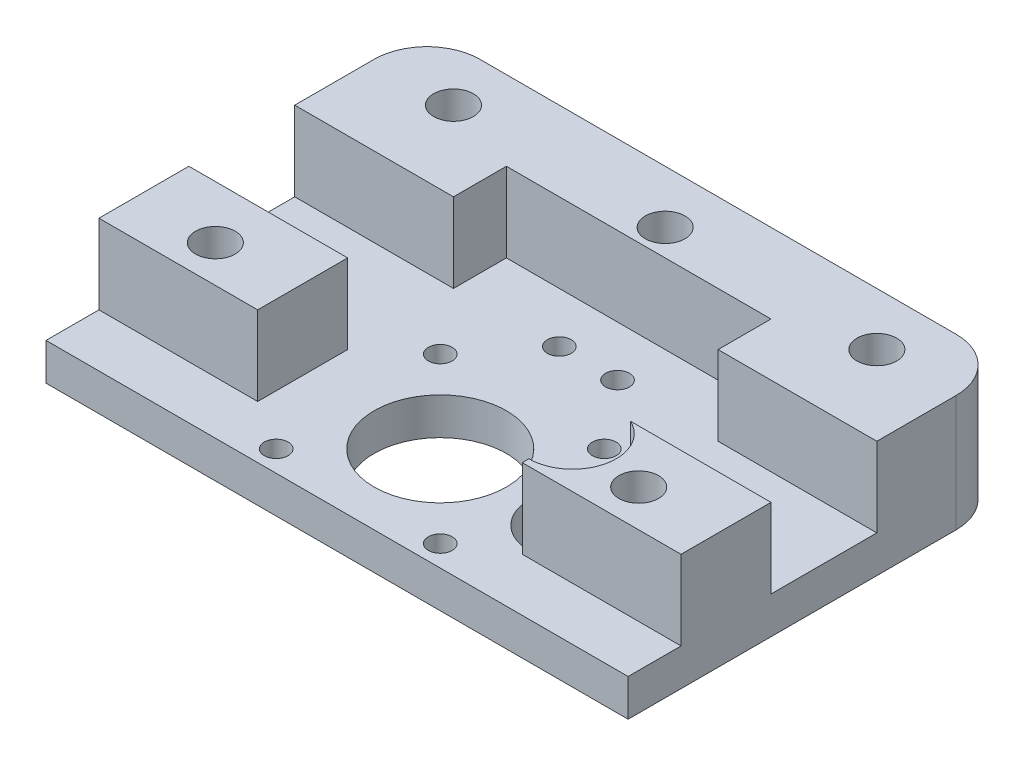
ISO-10303-21;
HEADER;
FILE_DESCRIPTION(('STEP AP214'),'2;1');
FILE_NAME('part.step','',(''),(''),'','','');
FILE_SCHEMA(('AUTOMOTIVE_DESIGN { 1 0 10303 214 1 1 1 1 }'));
ENDSEC;
DATA;
#1=APPLICATION_CONTEXT('core data for automotive mechanical design processes');
#2=APPLICATION_PROTOCOL_DEFINITION('international standard','automotive_design',2000,#1);
#3=PRODUCT_CONTEXT('',#1,'mechanical');
#4=PRODUCT('Part','Part','',(#3));
#5=PRODUCT_RELATED_PRODUCT_CATEGORY('part','',(#4));
#6=PRODUCT_DEFINITION_FORMATION('','',#4);
#7=PRODUCT_DEFINITION_CONTEXT('part definition',#1,'design');
#8=PRODUCT_DEFINITION('design','',#6,#7);
#9=PRODUCT_DEFINITION_SHAPE('','',#8);
#10=(LENGTH_UNIT() NAMED_UNIT(*) SI_UNIT(.MILLI.,.METRE.));
#11=(NAMED_UNIT(*) PLANE_ANGLE_UNIT() SI_UNIT($,.RADIAN.));
#12=(NAMED_UNIT(*) SI_UNIT($,.STERADIAN.) SOLID_ANGLE_UNIT());
#13=UNCERTAINTY_MEASURE_WITH_UNIT(LENGTH_MEASURE(1.E-05),#10,'distance_accuracy_value','');
#14=(GEOMETRIC_REPRESENTATION_CONTEXT(3) GLOBAL_UNCERTAINTY_ASSIGNED_CONTEXT((#13)) GLOBAL_UNIT_ASSIGNED_CONTEXT((#10,
#11,#12)) REPRESENTATION_CONTEXT('',''));
#15=CARTESIAN_POINT('',(0.,0.,0.));
#16=DIRECTION('',(0.,0.,1.));
#17=DIRECTION('',(1.,0.,0.));
#18=AXIS2_PLACEMENT_3D('',#15,#16,#17);
#19=CARTESIAN_POINT('',(-25.,22.,-21.));
#20=DIRECTION('',(-1.,0.,0.));
#21=DIRECTION('',(0.,0.,1.));
#22=AXIS2_PLACEMENT_3D('',#19,#20,#21);
#23=PLANE('',#22);
#24=DIRECTION('',(0.,0.,-1.));
#25=VECTOR('',#24,1.);
#26=CARTESIAN_POINT('',(-25.,7.,-21.));
#27=LINE('',#26,#25);
#28=CARTESIAN_POINT('',(-25.,7.,26.));
#29=VERTEX_POINT('',#28);
#30=CARTESIAN_POINT('',(-25.,7.,9.00000000000001));
#31=VERTEX_POINT('',#30);
#32=EDGE_CURVE('E236',#29,#31,#27,.T.);
#33=ORIENTED_EDGE('',*,*,#32,.T.);
#34=DIRECTION('',(0.,1.,0.));
#35=VECTOR('',#34,1.);
#36=CARTESIAN_POINT('',(-25.,-29.0555127546399,9.00000000000001));
#37=LINE('',#36,#35);
#38=CARTESIAN_POINT('',(-25.,22.,9.00000000000001));
#39=VERTEX_POINT('',#38);
#40=EDGE_CURVE('E502',#31,#39,#37,.T.);
#41=ORIENTED_EDGE('',*,*,#40,.T.);
#42=DIRECTION('',(0.,0.,-1.));
#43=VECTOR('',#42,1.);
#44=CARTESIAN_POINT('',(-25.,22.,-21.));
#45=LINE('',#44,#43);
#46=CARTESIAN_POINT('',(-25.,22.,26.));
#47=VERTEX_POINT('',#46);
#48=EDGE_CURVE('E215',#47,#39,#45,.T.);
#49=ORIENTED_EDGE('',*,*,#48,.F.);
#50=DIRECTION('',(0.,-1.,0.));
#51=VECTOR('',#50,1.);
#52=CARTESIAN_POINT('',(-25.,22.,26.));
#53=LINE('',#52,#51);
#54=EDGE_CURVE('E267',#47,#29,#53,.T.);
#55=ORIENTED_EDGE('',*,*,#54,.T.);
#56=EDGE_LOOP('',(#33,#41,#49,#55));
#57=FACE_BOUND('',#56,.T.);
#58=ADVANCED_FACE('F39',(#57),#23,.F.);
#59=CARTESIAN_POINT('',(25.,22.,-21.));
#60=DIRECTION('',(1.,0.,0.));
#61=DIRECTION('',(0.,0.,-1.));
#62=AXIS2_PLACEMENT_3D('',#59,#60,#61);
#63=PLANE('',#62);
#64=DIRECTION('',(0.,0.,1.));
#65=VECTOR('',#64,1.);
#66=CARTESIAN_POINT('',(25.,22.,-21.));
#67=LINE('',#66,#65);
#68=CARTESIAN_POINT('',(25.,22.,24.75));
#69=VERTEX_POINT('',#68);
#70=CARTESIAN_POINT('',(25.,22.,26.));
#71=VERTEX_POINT('',#70);
#72=EDGE_CURVE('E197',#69,#71,#67,.T.);
#73=ORIENTED_EDGE('',*,*,#72,.F.);
#74=DIRECTION('',(0.,-1.,0.));
#75=VECTOR('',#74,1.);
#76=CARTESIAN_POINT('',(25.,22.,24.75));
#77=LINE('',#76,#75);
#78=CARTESIAN_POINT('',(25.,7.,24.75));
#79=VERTEX_POINT('',#78);
#80=EDGE_CURVE('E181',#69,#79,#77,.T.);
#81=ORIENTED_EDGE('',*,*,#80,.T.);
#82=DIRECTION('',(0.,0.,1.));
#83=VECTOR('',#82,1.);
#84=CARTESIAN_POINT('',(25.,7.,-21.));
#85=LINE('',#84,#83);
#86=CARTESIAN_POINT('',(25.,7.,26.));
#87=VERTEX_POINT('',#86);
#88=EDGE_CURVE('E249',#79,#87,#85,.T.);
#89=ORIENTED_EDGE('',*,*,#88,.T.);
#90=DIRECTION('',(0.,-1.,0.));
#91=VECTOR('',#90,1.);
#92=CARTESIAN_POINT('',(25.,22.,26.));
#93=LINE('',#92,#91);
#94=EDGE_CURVE('E205',#71,#87,#93,.T.);
#95=ORIENTED_EDGE('',*,*,#94,.F.);
#96=EDGE_LOOP('',(#73,#81,#89,#95));
#97=FACE_BOUND('',#96,.T.);
#98=ADVANCED_FACE('F203',(#97),#63,.F.);
#99=CARTESIAN_POINT('',(0.,22.,0.));
#100=DIRECTION('',(0.,1.,0.));
#101=DIRECTION('',(0.,0.,1.));
#102=AXIS2_PLACEMENT_3D('',#99,#100,#101);
#103=PLANE('',#102);
#104=CARTESIAN_POINT('',(25.,22.,16.5));
#105=DIRECTION('',(0.,-1.,0.));
#106=DIRECTION('',(0.,0.,-1.));
#107=AXIS2_PLACEMENT_3D('',#104,#105,#106);
#108=CIRCLE('',#107,8.25);
#109=CARTESIAN_POINT('',(28.4369317712169,22.,9.00000000000001));
#110=VERTEX_POINT('',#109);
#111=EDGE_CURVE('E55',#110,#69,#108,.T.);
#112=ORIENTED_EDGE('',*,*,#111,.T.);
#113=ORIENTED_EDGE('',*,*,#72,.T.);
#114=DIRECTION('',(1.,0.,0.));
#115=VECTOR('',#114,1.);
#116=CARTESIAN_POINT('',(55.,22.,26.));
#117=LINE('',#116,#115);
#118=CARTESIAN_POINT('',(55.,22.,26.));
#119=VERTEX_POINT('',#118);
#120=EDGE_CURVE('E214',#71,#119,#117,.T.);
#121=ORIENTED_EDGE('',*,*,#120,.T.);
#122=DIRECTION('',(0.,0.,-1.));
#123=VECTOR('',#122,1.);
#124=CARTESIAN_POINT('',(55.,22.,-36.));
#125=LINE('',#124,#123);
#126=CARTESIAN_POINT('',(55.,22.,9.));
#127=VERTEX_POINT('',#126);
#128=EDGE_CURVE('E222',#119,#127,#125,.T.);
#129=ORIENTED_EDGE('',*,*,#128,.T.);
#130=DIRECTION('',(1.,0.,0.));
#131=VECTOR('',#130,1.);
#132=CARTESIAN_POINT('',(55.,22.,9.));
#133=LINE('',#132,#131);
#134=EDGE_CURVE('E200',#110,#127,#133,.T.);
#135=ORIENTED_EDGE('',*,*,#134,.F.);
#136=EDGE_LOOP('',(#112,#113,#121,#129,#135));
#137=FACE_BOUND('',#136,.T.);
#138=CARTESIAN_POINT('',(40.,22.,19.));
#139=DIRECTION('',(0.,-1.,0.));
#140=DIRECTION('',(0.,0.,-1.));
#141=AXIS2_PLACEMENT_3D('',#138,#139,#140);
#142=CIRCLE('',#141,3.75);
#143=CARTESIAN_POINT('',(40.,22.,15.25));
#144=VERTEX_POINT('',#143);
#145=EDGE_CURVE('E547',#144,#144,#142,.T.);
#146=ORIENTED_EDGE('',*,*,#145,.T.);
#147=EDGE_LOOP('',(#146));
#148=FACE_BOUND('',#147,.T.);
#149=ADVANCED_FACE('F195',(#137,#148),#103,.T.);
#150=DIRECTION('',(1.,0.,0.));
#151=VECTOR('',#150,1.);
#152=CARTESIAN_POINT('',(-25.,22.,9.00000000000001));
#153=LINE('',#152,#151);
#154=CARTESIAN_POINT('',(-55.,22.,9.00000000000002));
#155=VERTEX_POINT('',#154);
#156=EDGE_CURVE('E507',#155,#39,#153,.T.);
#157=ORIENTED_EDGE('',*,*,#156,.F.);
#158=DIRECTION('',(0.,0.,1.));
#159=VECTOR('',#158,1.);
#160=CARTESIAN_POINT('',(-55.,22.,-36.));
#161=LINE('',#160,#159);
#162=CARTESIAN_POINT('',(-55.,22.,26.));
#163=VERTEX_POINT('',#162);
#164=EDGE_CURVE('E253',#155,#163,#161,.T.);
#165=ORIENTED_EDGE('',*,*,#164,.T.);
#166=DIRECTION('',(1.,0.,0.));
#167=VECTOR('',#166,1.);
#168=CARTESIAN_POINT('',(-55.,22.,26.));
#169=LINE('',#168,#167);
#170=EDGE_CURVE('E432',#163,#47,#169,.T.);
#171=ORIENTED_EDGE('',*,*,#170,.T.);
#172=ORIENTED_EDGE('',*,*,#48,.T.);
#173=EDGE_LOOP('',(#157,#165,#171,#172));
#174=FACE_BOUND('',#173,.T.);
#175=CARTESIAN_POINT('',(-40.,22.,19.));
#176=DIRECTION('',(0.,-1.,0.));
#177=DIRECTION('',(0.,0.,-1.));
#178=AXIS2_PLACEMENT_3D('',#175,#176,#177);
#179=CIRCLE('',#178,3.75);
#180=CARTESIAN_POINT('',(-40.,22.,15.25));
#181=VERTEX_POINT('',#180);
#182=EDGE_CURVE('E531',#181,#181,#179,.T.);
#183=ORIENTED_EDGE('',*,*,#182,.T.);
#184=EDGE_LOOP('',(#183));
#185=FACE_BOUND('',#184,.T.);
#186=ADVANCED_FACE('F572',(#174,#185),#103,.T.);
#187=CARTESIAN_POINT('',(0.,7.,0.));
#188=DIRECTION('',(0.,1.,0.));
#189=DIRECTION('',(0.,0.,1.));
#190=AXIS2_PLACEMENT_3D('',#187,#188,#189);
#191=PLANE('',#190);
#192=DIRECTION('',(1.,0.,0.));
#193=VECTOR('',#192,1.);
#194=CARTESIAN_POINT('',(55.,7.,26.));
#195=LINE('',#194,#193);
#196=CARTESIAN_POINT('',(55.,7.,26.));
#197=VERTEX_POINT('',#196);
#198=EDGE_CURVE('E248',#87,#197,#195,.T.);
#199=ORIENTED_EDGE('',*,*,#198,.F.);
#200=ORIENTED_EDGE('',*,*,#88,.F.);
#201=CARTESIAN_POINT('',(25.,7.,16.5));
#202=DIRECTION('',(0.,1.,0.));
#203=DIRECTION('',(0.,0.,1.));
#204=AXIS2_PLACEMENT_3D('',#201,#202,#203);
#205=CIRCLE('',#204,8.25);
#206=CARTESIAN_POINT('',(28.4369317712169,7.,9.00000000000001));
#207=VERTEX_POINT('',#206);
#208=EDGE_CURVE('E185',#207,#79,#205,.T.);
#209=ORIENTED_EDGE('',*,*,#208,.F.);
#210=DIRECTION('',(-1.,0.,0.));
#211=VECTOR('',#210,1.);
#212=CARTESIAN_POINT('',(55.,7.,9.));
#213=LINE('',#212,#211);
#214=CARTESIAN_POINT('',(55.,7.,9.));
#215=VERTEX_POINT('',#214);
#216=EDGE_CURVE('E483',#215,#207,#213,.T.);
#217=ORIENTED_EDGE('',*,*,#216,.F.);
#218=DIRECTION('',(0.,0.,1.));
#219=VECTOR('',#218,1.);
#220=CARTESIAN_POINT('',(55.,7.,9.));
#221=LINE('',#220,#219);
#222=CARTESIAN_POINT('',(55.,7.,-11.));
#223=VERTEX_POINT('',#222);
#224=EDGE_CURVE('E479',#223,#215,#221,.T.);
#225=ORIENTED_EDGE('',*,*,#224,.F.);
#226=DIRECTION('',(1.,0.,0.));
#227=VECTOR('',#226,1.);
#228=CARTESIAN_POINT('',(55.,7.,-11.));
#229=LINE('',#228,#227);
#230=CARTESIAN_POINT('',(25.,7.,-11.));
#231=VERTEX_POINT('',#230);
#232=EDGE_CURVE('E493',#231,#223,#229,.T.);
#233=ORIENTED_EDGE('',*,*,#232,.F.);
#234=CARTESIAN_POINT('',(25.,7.,-21.));
#235=VERTEX_POINT('',#234);
#236=EDGE_CURVE('E244',#235,#231,#85,.T.);
#237=ORIENTED_EDGE('',*,*,#236,.F.);
#238=DIRECTION('',(1.,0.,0.));
#239=VECTOR('',#238,1.);
#240=CARTESIAN_POINT('',(25.,7.,-21.));
#241=LINE('',#240,#239);
#242=CARTESIAN_POINT('',(-25.,7.,-21.));
#243=VERTEX_POINT('',#242);
#244=EDGE_CURVE('E240',#243,#235,#241,.T.);
#245=ORIENTED_EDGE('',*,*,#244,.F.);
#246=CARTESIAN_POINT('',(-25.,7.,-11.));
#247=VERTEX_POINT('',#246);
#248=EDGE_CURVE('E234',#247,#243,#27,.T.);
#249=ORIENTED_EDGE('',*,*,#248,.F.);
#250=DIRECTION('',(1.,0.,0.));
#251=VECTOR('',#250,1.);
#252=CARTESIAN_POINT('',(-25.,7.,-11.));
#253=LINE('',#252,#251);
#254=CARTESIAN_POINT('',(-55.,7.,-11.));
#255=VERTEX_POINT('',#254);
#256=EDGE_CURVE('E464',#255,#247,#253,.T.);
#257=ORIENTED_EDGE('',*,*,#256,.F.);
#258=DIRECTION('',(0.,0.,-1.));
#259=VECTOR('',#258,1.);
#260=CARTESIAN_POINT('',(-55.,7.,9.00000000000002));
#261=LINE('',#260,#259);
#262=CARTESIAN_POINT('',(-55.,7.,9.00000000000002));
#263=VERTEX_POINT('',#262);
#264=EDGE_CURVE('E497',#263,#255,#261,.T.);
#265=ORIENTED_EDGE('',*,*,#264,.F.);
#266=DIRECTION('',(-1.,0.,0.));
#267=VECTOR('',#266,1.);
#268=CARTESIAN_POINT('',(-25.,7.,9.00000000000001));
#269=LINE('',#268,#267);
#270=EDGE_CURVE('E501',#31,#263,#269,.T.);
#271=ORIENTED_EDGE('',*,*,#270,.F.);
#272=ORIENTED_EDGE('',*,*,#32,.F.);
#273=DIRECTION('',(1.,0.,0.));
#274=VECTOR('',#273,1.);
#275=CARTESIAN_POINT('',(-55.,7.,26.));
#276=LINE('',#275,#274);
#277=CARTESIAN_POINT('',(-55.,7.,26.));
#278=VERTEX_POINT('',#277);
#279=EDGE_CURVE('E230',#278,#29,#276,.T.);
#280=ORIENTED_EDGE('',*,*,#279,.F.);
#281=DIRECTION('',(0.,0.,1.));
#282=VECTOR('',#281,1.);
#283=CARTESIAN_POINT('',(-55.,7.,-36.));
#284=LINE('',#283,#282);
#285=CARTESIAN_POINT('',(-55.,7.,36.));
#286=VERTEX_POINT('',#285);
#287=EDGE_CURVE('E341',#278,#286,#284,.T.);
#288=ORIENTED_EDGE('',*,*,#287,.T.);
#289=DIRECTION('',(1.,0.,0.));
#290=VECTOR('',#289,1.);
#291=CARTESIAN_POINT('',(-55.,7.,36.));
#292=LINE('',#291,#290);
#293=CARTESIAN_POINT('',(55.,7.,36.));
#294=VERTEX_POINT('',#293);
#295=EDGE_CURVE('E345',#286,#294,#292,.T.);
#296=ORIENTED_EDGE('',*,*,#295,.T.);
#297=DIRECTION('',(0.,0.,-1.));
#298=VECTOR('',#297,1.);
#299=CARTESIAN_POINT('',(55.,7.,-36.));
#300=LINE('',#299,#298);
#301=EDGE_CURVE('E338',#294,#197,#300,.T.);
#302=ORIENTED_EDGE('',*,*,#301,.T.);
#303=EDGE_LOOP('',(#199,#200,#209,#217,#225,#233,#237,#245,#249,#257,#265,#271,#272,#280,#288,
#296,#302));
#304=FACE_BOUND('',#303,.T.);
#305=CARTESIAN_POINT('',(-5.5,7.,-11.5));
#306=DIRECTION('',(0.,1.,0.));
#307=DIRECTION('',(0.,0.,1.));
#308=AXIS2_PLACEMENT_3D('',#305,#306,#307);
#309=CIRCLE('',#308,2.25);
#310=CARTESIAN_POINT('',(-5.5,7.,-9.24999999999999));
#311=VERTEX_POINT('',#310);
#312=EDGE_CURVE('E284',#311,#311,#309,.T.);
#313=ORIENTED_EDGE('',*,*,#312,.F.);
#314=EDGE_LOOP('',(#313));
#315=FACE_BOUND('',#314,.T.);
#316=CARTESIAN_POINT('',(15.5,7.,32.));
#317=DIRECTION('',(0.,1.,0.));
#318=DIRECTION('',(0.,0.,1.));
#319=AXIS2_PLACEMENT_3D('',#316,#317,#318);
#320=CIRCLE('',#319,2.25);
#321=CARTESIAN_POINT('',(15.5,7.,34.25));
#322=VERTEX_POINT('',#321);
#323=EDGE_CURVE('E298',#322,#322,#320,.T.);
#324=ORIENTED_EDGE('',*,*,#323,.F.);
#325=EDGE_LOOP('',(#324));
#326=FACE_BOUND('',#325,.T.);
#327=CARTESIAN_POINT('',(-15.5,7.,32.));
#328=DIRECTION('',(0.,1.,0.));
#329=DIRECTION('',(0.,0.,1.));
#330=AXIS2_PLACEMENT_3D('',#327,#328,#329);
#331=CIRCLE('',#330,2.25);
#332=CARTESIAN_POINT('',(-15.5,7.,34.25));
#333=VERTEX_POINT('',#332);
#334=EDGE_CURVE('E314',#333,#333,#331,.T.);
#335=ORIENTED_EDGE('',*,*,#334,.F.);
#336=EDGE_LOOP('',(#335));
#337=FACE_BOUND('',#336,.T.);
#338=CARTESIAN_POINT('',(0.,7.,16.5));
#339=DIRECTION('',(0.,1.,0.));
#340=DIRECTION('',(0.,0.,1.));
#341=AXIS2_PLACEMENT_3D('',#338,#339,#340);
#342=CIRCLE('',#341,12.5);
#343=CARTESIAN_POINT('',(0.,7.,29.));
#344=VERTEX_POINT('',#343);
#345=EDGE_CURVE('E330',#344,#344,#342,.T.);
#346=ORIENTED_EDGE('',*,*,#345,.F.);
#347=EDGE_LOOP('',(#346));
#348=FACE_BOUND('',#347,.T.);
#349=CARTESIAN_POINT('',(-15.5,7.,1.));
#350=DIRECTION('',(0.,1.,0.));
#351=DIRECTION('',(0.,0.,1.));
#352=AXIS2_PLACEMENT_3D('',#349,#350,#351);
#353=CIRCLE('',#352,2.25);
#354=CARTESIAN_POINT('',(-15.5,7.,3.25));
#355=VERTEX_POINT('',#354);
#356=EDGE_CURVE('E322',#355,#355,#353,.T.);
#357=ORIENTED_EDGE('',*,*,#356,.F.);
#358=EDGE_LOOP('',(#357));
#359=FACE_BOUND('',#358,.T.);
#360=CARTESIAN_POINT('',(15.5,7.,1.));
#361=DIRECTION('',(0.,1.,0.));
#362=DIRECTION('',(0.,0.,1.));
#363=AXIS2_PLACEMENT_3D('',#360,#361,#362);
#364=CIRCLE('',#363,2.25);
#365=CARTESIAN_POINT('',(15.5,7.,3.25));
#366=VERTEX_POINT('',#365);
#367=EDGE_CURVE('E306',#366,#366,#364,.T.);
#368=ORIENTED_EDGE('',*,*,#367,.F.);
#369=EDGE_LOOP('',(#368));
#370=FACE_BOUND('',#369,.T.);
#371=CARTESIAN_POINT('',(5.5,7.,-11.5));
#372=DIRECTION('',(0.,1.,0.));
#373=DIRECTION('',(0.,0.,1.));
#374=AXIS2_PLACEMENT_3D('',#371,#372,#373);
#375=CIRCLE('',#374,2.25);
#376=CARTESIAN_POINT('',(5.5,7.,-9.24999999999999));
#377=VERTEX_POINT('',#376);
#378=EDGE_CURVE('E276',#377,#377,#375,.T.);
#379=ORIENTED_EDGE('',*,*,#378,.F.);
#380=EDGE_LOOP('',(#379));
#381=FACE_BOUND('',#380,.T.);
#382=ADVANCED_FACE('F564',(#304,#315,#326,#337,#348,#359,#370,#381),#191,.T.);
#383=CARTESIAN_POINT('',(0.,0.,0.));
#384=DIRECTION('',(0.,1.,0.));
#385=DIRECTION('',(0.,0.,1.));
#386=AXIS2_PLACEMENT_3D('',#383,#384,#385);
#387=PLANE('',#386);
#388=CARTESIAN_POINT('',(40.,0.,19.));
#389=DIRECTION('',(0.,-1.,0.));
#390=DIRECTION('',(0.,0.,-1.));
#391=AXIS2_PLACEMENT_3D('',#388,#389,#390);
#392=CIRCLE('',#391,3.75);
#393=CARTESIAN_POINT('',(40.,0.,15.25));
#394=VERTEX_POINT('',#393);
#395=EDGE_CURVE('E496',#394,#394,#392,.T.);
#396=ORIENTED_EDGE('',*,*,#395,.F.);
#397=EDGE_LOOP('',(#396));
#398=FACE_BOUND('',#397,.T.);
#399=CARTESIAN_POINT('',(0.,0.,-26.));
#400=DIRECTION('',(0.,-1.,0.));
#401=DIRECTION('',(0.,0.,-1.));
#402=AXIS2_PLACEMENT_3D('',#399,#400,#401);
#403=CIRCLE('',#402,3.75);
#404=CARTESIAN_POINT('',(0.,0.,-29.75));
#405=VERTEX_POINT('',#404);
#406=EDGE_CURVE('E543',#405,#405,#403,.T.);
#407=ORIENTED_EDGE('',*,*,#406,.F.);
#408=EDGE_LOOP('',(#407));
#409=FACE_BOUND('',#408,.T.);
#410=CARTESIAN_POINT('',(-40.,0.,19.));
#411=DIRECTION('',(0.,-1.,0.));
#412=DIRECTION('',(0.,0.,-1.));
#413=AXIS2_PLACEMENT_3D('',#410,#411,#412);
#414=CIRCLE('',#413,3.75);
#415=CARTESIAN_POINT('',(-40.,0.,15.25));
#416=VERTEX_POINT('',#415);
#417=EDGE_CURVE('E535',#416,#416,#414,.T.);
#418=ORIENTED_EDGE('',*,*,#417,.F.);
#419=EDGE_LOOP('',(#418));
#420=FACE_BOUND('',#419,.T.);
#421=CARTESIAN_POINT('',(-40.,0.,-26.));
#422=DIRECTION('',(0.,-1.,0.));
#423=DIRECTION('',(0.,0.,-1.));
#424=AXIS2_PLACEMENT_3D('',#421,#422,#423);
#425=CIRCLE('',#424,3.75);
#426=CARTESIAN_POINT('',(-40.,0.,-29.75));
#427=VERTEX_POINT('',#426);
#428=EDGE_CURVE('E527',#427,#427,#425,.T.);
#429=ORIENTED_EDGE('',*,*,#428,.F.);
#430=EDGE_LOOP('',(#429));
#431=FACE_BOUND('',#430,.T.);
#432=CARTESIAN_POINT('',(40.,0.,-26.));
#433=DIRECTION('',(0.,-1.,0.));
#434=DIRECTION('',(0.,0.,-1.));
#435=AXIS2_PLACEMENT_3D('',#432,#433,#434);
#436=CIRCLE('',#435,3.75000000000001);
#437=CARTESIAN_POINT('',(40.,0.,-29.75));
#438=VERTEX_POINT('',#437);
#439=EDGE_CURVE('E439',#438,#438,#436,.T.);
#440=ORIENTED_EDGE('',*,*,#439,.F.);
#441=EDGE_LOOP('',(#440));
#442=FACE_BOUND('',#441,.T.);
#443=DIRECTION('',(-1.,0.,0.));
#444=VECTOR('',#443,1.);
#445=CARTESIAN_POINT('',(-55.,0.,-36.));
#446=LINE('',#445,#444);
#447=CARTESIAN_POINT('',(45.,0.,-36.));
#448=VERTEX_POINT('',#447);
#449=CARTESIAN_POINT('',(-45.,0.,-36.));
#450=VERTEX_POINT('',#449);
#451=EDGE_CURVE('E352',#448,#450,#446,.T.);
#452=ORIENTED_EDGE('',*,*,#451,.F.);
#453=CARTESIAN_POINT('',(45.,0.,-26.));
#454=DIRECTION('',(0.,1.,0.));
#455=DIRECTION('',(0.,0.,1.));
#456=AXIS2_PLACEMENT_3D('',#453,#454,#455);
#457=CIRCLE('',#456,10.);
#458=CARTESIAN_POINT('',(55.,0.,-26.));
#459=VERTEX_POINT('',#458);
#460=EDGE_CURVE('E378',#448,#459,#457,.F.);
#461=ORIENTED_EDGE('',*,*,#460,.T.);
#462=DIRECTION('',(0.,0.,-1.));
#463=VECTOR('',#462,1.);
#464=CARTESIAN_POINT('',(55.,0.,-36.));
#465=LINE('',#464,#463);
#466=CARTESIAN_POINT('',(55.,0.,36.));
#467=VERTEX_POINT('',#466);
#468=EDGE_CURVE('E334',#467,#459,#465,.T.);
#469=ORIENTED_EDGE('',*,*,#468,.F.);
#470=DIRECTION('',(1.,0.,0.));
#471=VECTOR('',#470,1.);
#472=CARTESIAN_POINT('',(-55.,0.,36.));
#473=LINE('',#472,#471);
#474=CARTESIAN_POINT('',(-55.,0.,36.));
#475=VERTEX_POINT('',#474);
#476=EDGE_CURVE('E342',#475,#467,#473,.T.);
#477=ORIENTED_EDGE('',*,*,#476,.F.);
#478=DIRECTION('',(0.,0.,1.));
#479=VECTOR('',#478,1.);
#480=CARTESIAN_POINT('',(-55.,0.,-36.));
#481=LINE('',#480,#479);
#482=CARTESIAN_POINT('',(-55.,0.,-26.));
#483=VERTEX_POINT('',#482);
#484=EDGE_CURVE('E356',#483,#475,#481,.T.);
#485=ORIENTED_EDGE('',*,*,#484,.F.);
#486=CARTESIAN_POINT('',(-45.,0.,-26.));
#487=DIRECTION('',(0.,1.,0.));
#488=DIRECTION('',(0.,0.,1.));
#489=AXIS2_PLACEMENT_3D('',#486,#487,#488);
#490=CIRCLE('',#489,10.);
#491=EDGE_CURVE('E375',#483,#450,#490,.F.);
#492=ORIENTED_EDGE('',*,*,#491,.T.);
#493=EDGE_LOOP('',(#452,#461,#469,#477,#485,#492));
#494=FACE_BOUND('',#493,.T.);
#495=CARTESIAN_POINT('',(0.,0.,16.5));
#496=DIRECTION('',(0.,1.,0.));
#497=DIRECTION('',(0.,0.,1.));
#498=AXIS2_PLACEMENT_3D('',#495,#496,#497);
#499=CIRCLE('',#498,12.5);
#500=CARTESIAN_POINT('',(0.,0.,29.));
#501=VERTEX_POINT('',#500);
#502=EDGE_CURVE('E326',#501,#501,#499,.T.);
#503=ORIENTED_EDGE('',*,*,#502,.T.);
#504=EDGE_LOOP('',(#503));
#505=FACE_BOUND('',#504,.T.);
#506=CARTESIAN_POINT('',(-15.5,0.,1.));
#507=DIRECTION('',(0.,1.,0.));
#508=DIRECTION('',(0.,0.,1.));
#509=AXIS2_PLACEMENT_3D('',#506,#507,#508);
#510=CIRCLE('',#509,2.25);
#511=CARTESIAN_POINT('',(-15.5,0.,3.25));
#512=VERTEX_POINT('',#511);
#513=EDGE_CURVE('E318',#512,#512,#510,.T.);
#514=ORIENTED_EDGE('',*,*,#513,.T.);
#515=EDGE_LOOP('',(#514));
#516=FACE_BOUND('',#515,.T.);
#517=CARTESIAN_POINT('',(-15.5,0.,32.));
#518=DIRECTION('',(0.,1.,0.));
#519=DIRECTION('',(0.,0.,1.));
#520=AXIS2_PLACEMENT_3D('',#517,#518,#519);
#521=CIRCLE('',#520,2.25);
#522=CARTESIAN_POINT('',(-15.5,0.,34.25));
#523=VERTEX_POINT('',#522);
#524=EDGE_CURVE('E310',#523,#523,#521,.T.);
#525=ORIENTED_EDGE('',*,*,#524,.T.);
#526=EDGE_LOOP('',(#525));
#527=FACE_BOUND('',#526,.T.);
#528=CARTESIAN_POINT('',(15.5,0.,1.));
#529=DIRECTION('',(0.,1.,0.));
#530=DIRECTION('',(0.,0.,1.));
#531=AXIS2_PLACEMENT_3D('',#528,#529,#530);
#532=CIRCLE('',#531,2.25);
#533=CARTESIAN_POINT('',(15.5,0.,3.25));
#534=VERTEX_POINT('',#533);
#535=EDGE_CURVE('E302',#534,#534,#532,.T.);
#536=ORIENTED_EDGE('',*,*,#535,.T.);
#537=EDGE_LOOP('',(#536));
#538=FACE_BOUND('',#537,.T.);
#539=CARTESIAN_POINT('',(15.5,0.,32.));
#540=DIRECTION('',(0.,1.,0.));
#541=DIRECTION('',(0.,0.,1.));
#542=AXIS2_PLACEMENT_3D('',#539,#540,#541);
#543=CIRCLE('',#542,2.25);
#544=CARTESIAN_POINT('',(15.5,0.,34.25));
#545=VERTEX_POINT('',#544);
#546=EDGE_CURVE('E294',#545,#545,#543,.T.);
#547=ORIENTED_EDGE('',*,*,#546,.T.);
#548=EDGE_LOOP('',(#547));
#549=FACE_BOUND('',#548,.T.);
#550=CARTESIAN_POINT('',(25.,0.,16.5));
#551=DIRECTION('',(0.,1.,0.));
#552=DIRECTION('',(0.,0.,1.));
#553=AXIS2_PLACEMENT_3D('',#550,#551,#552);
#554=CIRCLE('',#553,8.25);
#555=CARTESIAN_POINT('',(25.,0.,24.75));
#556=VERTEX_POINT('',#555);
#557=EDGE_CURVE('E288',#556,#556,#554,.T.);
#558=ORIENTED_EDGE('',*,*,#557,.T.);
#559=EDGE_LOOP('',(#558));
#560=FACE_BOUND('',#559,.T.);
#561=CARTESIAN_POINT('',(-5.5,0.,-11.5));
#562=DIRECTION('',(0.,1.,0.));
#563=DIRECTION('',(0.,0.,1.));
#564=AXIS2_PLACEMENT_3D('',#561,#562,#563);
#565=CIRCLE('',#564,2.25);
#566=CARTESIAN_POINT('',(-5.5,0.,-9.24999999999999));
#567=VERTEX_POINT('',#566);
#568=EDGE_CURVE('E280',#567,#567,#565,.T.);
#569=ORIENTED_EDGE('',*,*,#568,.T.);
#570=EDGE_LOOP('',(#569));
#571=FACE_BOUND('',#570,.T.);
#572=CARTESIAN_POINT('',(5.5,0.,-11.5));
#573=DIRECTION('',(0.,1.,0.));
#574=DIRECTION('',(0.,0.,1.));
#575=AXIS2_PLACEMENT_3D('',#572,#573,#574);
#576=CIRCLE('',#575,2.25);
#577=CARTESIAN_POINT('',(5.5,0.,-9.24999999999999));
#578=VERTEX_POINT('',#577);
#579=EDGE_CURVE('E275',#578,#578,#576,.T.);
#580=ORIENTED_EDGE('',*,*,#579,.T.);
#581=EDGE_LOOP('',(#580));
#582=FACE_BOUND('',#581,.T.);
#583=ADVANCED_FACE('F406',(#398,#409,#420,#431,#442,#494,#505,#516,#527,#538,#549,#560,#571,
#582),#387,.F.);
#584=CARTESIAN_POINT('',(55.,7.,-36.));
#585=DIRECTION('',(-1.,0.,0.));
#586=DIRECTION('',(0.,0.,1.));
#587=AXIS2_PLACEMENT_3D('',#584,#585,#586);
#588=PLANE('',#587);
#589=ORIENTED_EDGE('',*,*,#224,.T.);
#590=DIRECTION('',(0.,1.,0.));
#591=VECTOR('',#590,1.);
#592=CARTESIAN_POINT('',(55.,-29.0555127546399,9.));
#593=LINE('',#592,#591);
#594=EDGE_CURVE('E477',#215,#127,#593,.T.);
#595=ORIENTED_EDGE('',*,*,#594,.T.);
#596=ORIENTED_EDGE('',*,*,#128,.F.);
#597=DIRECTION('',(0.,-1.,0.));
#598=VECTOR('',#597,1.);
#599=CARTESIAN_POINT('',(55.,22.,26.));
#600=LINE('',#599,#598);
#601=EDGE_CURVE('E229',#119,#197,#600,.T.);
#602=ORIENTED_EDGE('',*,*,#601,.T.);
#603=ORIENTED_EDGE('',*,*,#301,.F.);
#604=DIRECTION('',(0.,-1.,0.));
#605=VECTOR('',#604,1.);
#606=CARTESIAN_POINT('',(55.,7.,36.));
#607=LINE('',#606,#605);
#608=EDGE_CURVE('E348',#294,#467,#607,.T.);
#609=ORIENTED_EDGE('',*,*,#608,.T.);
#610=ORIENTED_EDGE('',*,*,#468,.T.);
#611=DIRECTION('',(0.,-1.,0.));
#612=VECTOR('',#611,1.);
#613=CARTESIAN_POINT('',(55.,7.,-26.));
#614=LINE('',#613,#612);
#615=CARTESIAN_POINT('',(55.,22.,-26.));
#616=VERTEX_POINT('',#615);
#617=EDGE_CURVE('E381',#459,#616,#614,.F.);
#618=ORIENTED_EDGE('',*,*,#617,.T.);
#619=CARTESIAN_POINT('',(55.,22.,-11.));
#620=VERTEX_POINT('',#619);
#621=EDGE_CURVE('E221',#620,#616,#125,.T.);
#622=ORIENTED_EDGE('',*,*,#621,.F.);
#623=DIRECTION('',(0.,1.,0.));
#624=VECTOR('',#623,1.);
#625=CARTESIAN_POINT('',(55.,-29.0555127546399,-11.));
#626=LINE('',#625,#624);
#627=EDGE_CURVE('E467',#223,#620,#626,.T.);
#628=ORIENTED_EDGE('',*,*,#627,.F.);
#629=EDGE_LOOP('',(#589,#595,#596,#602,#603,#609,#610,#618,#622,#628));
#630=FACE_BOUND('',#629,.T.);
#631=ADVANCED_FACE('F411',(#630),#588,.F.);
#632=CARTESIAN_POINT('',(-55.,7.,-36.));
#633=DIRECTION('',(0.,0.,1.));
#634=DIRECTION('',(1.,0.,0.));
#635=AXIS2_PLACEMENT_3D('',#632,#633,#634);
#636=PLANE('',#635);
#637=DIRECTION('',(-1.,0.,0.));
#638=VECTOR('',#637,1.);
#639=CARTESIAN_POINT('',(-55.,22.,-36.));
#640=LINE('',#639,#638);
#641=CARTESIAN_POINT('',(45.,22.,-36.));
#642=VERTEX_POINT('',#641);
#643=CARTESIAN_POINT('',(-45.,22.,-36.));
#644=VERTEX_POINT('',#643);
#645=EDGE_CURVE('E225',#642,#644,#640,.T.);
#646=ORIENTED_EDGE('',*,*,#645,.F.);
#647=DIRECTION('',(0.,-1.,0.));
#648=VECTOR('',#647,1.);
#649=CARTESIAN_POINT('',(45.,7.,-36.));
#650=LINE('',#649,#648);
#651=EDGE_CURVE('E371',#642,#448,#650,.T.);
#652=ORIENTED_EDGE('',*,*,#651,.T.);
#653=ORIENTED_EDGE('',*,*,#451,.T.);
#654=DIRECTION('',(0.,-1.,0.));
#655=VECTOR('',#654,1.);
#656=CARTESIAN_POINT('',(-45.,7.,-36.));
#657=LINE('',#656,#655);
#658=EDGE_CURVE('E368',#450,#644,#657,.F.);
#659=ORIENTED_EDGE('',*,*,#658,.T.);
#660=EDGE_LOOP('',(#646,#652,#653,#659));
#661=FACE_BOUND('',#660,.T.);
#662=ADVANCED_FACE('F400',(#661),#636,.F.);
#663=CARTESIAN_POINT('',(-55.,7.,-36.));
#664=DIRECTION('',(1.,0.,0.));
#665=DIRECTION('',(0.,0.,-1.));
#666=AXIS2_PLACEMENT_3D('',#663,#664,#665);
#667=PLANE('',#666);
#668=ORIENTED_EDGE('',*,*,#164,.F.);
#669=DIRECTION('',(0.,1.,0.));
#670=VECTOR('',#669,1.);
#671=CARTESIAN_POINT('',(-55.,-29.0555127546399,9.00000000000002));
#672=LINE('',#671,#670);
#673=EDGE_CURVE('E513',#263,#155,#672,.T.);
#674=ORIENTED_EDGE('',*,*,#673,.F.);
#675=ORIENTED_EDGE('',*,*,#264,.T.);
#676=DIRECTION('',(0.,1.,0.));
#677=VECTOR('',#676,1.);
#678=CARTESIAN_POINT('',(-55.,-29.0555127546399,-11.));
#679=LINE('',#678,#677);
#680=CARTESIAN_POINT('',(-55.,22.,-11.));
#681=VERTEX_POINT('',#680);
#682=EDGE_CURVE('E516',#255,#681,#679,.T.);
#683=ORIENTED_EDGE('',*,*,#682,.T.);
#684=CARTESIAN_POINT('',(-55.,22.,-26.));
#685=VERTEX_POINT('',#684);
#686=EDGE_CURVE('E427',#685,#681,#161,.T.);
#687=ORIENTED_EDGE('',*,*,#686,.F.);
#688=DIRECTION('',(0.,-1.,0.));
#689=VECTOR('',#688,1.);
#690=CARTESIAN_POINT('',(-55.,7.,-26.));
#691=LINE('',#690,#689);
#692=EDGE_CURVE('E11',#685,#483,#691,.T.);
#693=ORIENTED_EDGE('',*,*,#692,.T.);
#694=ORIENTED_EDGE('',*,*,#484,.T.);
#695=DIRECTION('',(0.,-1.,0.));
#696=VECTOR('',#695,1.);
#697=CARTESIAN_POINT('',(-55.,7.,36.));
#698=LINE('',#697,#696);
#699=EDGE_CURVE('E364',#286,#475,#698,.T.);
#700=ORIENTED_EDGE('',*,*,#699,.F.);
#701=ORIENTED_EDGE('',*,*,#287,.F.);
#702=DIRECTION('',(0.,-1.,0.));
#703=VECTOR('',#702,1.);
#704=CARTESIAN_POINT('',(-55.,22.,26.));
#705=LINE('',#704,#703);
#706=EDGE_CURVE('E271',#163,#278,#705,.T.);
#707=ORIENTED_EDGE('',*,*,#706,.F.);
#708=EDGE_LOOP('',(#668,#674,#675,#683,#687,#693,#694,#700,#701,#707));
#709=FACE_BOUND('',#708,.T.);
#710=ADVANCED_FACE('F421',(#709),#667,.F.);
#711=CARTESIAN_POINT('',(-55.,7.,36.));
#712=DIRECTION('',(0.,0.,-1.));
#713=DIRECTION('',(-1.,0.,0.));
#714=AXIS2_PLACEMENT_3D('',#711,#712,#713);
#715=PLANE('',#714);
#716=ORIENTED_EDGE('',*,*,#476,.T.);
#717=ORIENTED_EDGE('',*,*,#608,.F.);
#718=ORIENTED_EDGE('',*,*,#295,.F.);
#719=ORIENTED_EDGE('',*,*,#699,.T.);
#720=EDGE_LOOP('',(#716,#717,#718,#719));
#721=FACE_BOUND('',#720,.T.);
#722=ADVANCED_FACE('F416',(#721),#715,.F.);
#723=CARTESIAN_POINT('',(0.,7.,16.5));
#724=DIRECTION('',(0.,-1.,0.));
#725=DIRECTION('',(0.,0.,-1.));
#726=AXIS2_PLACEMENT_3D('',#723,#724,#725);
#727=CYLINDRICAL_SURFACE('',#726,12.5);
#728=ORIENTED_EDGE('',*,*,#345,.T.);
#729=EDGE_LOOP('',(#728));
#730=FACE_BOUND('',#729,.T.);
#731=ORIENTED_EDGE('',*,*,#502,.F.);
#732=EDGE_LOOP('',(#731));
#733=FACE_BOUND('',#732,.T.);
#734=ADVANCED_FACE('F621',(#730,#733),#727,.F.);
#735=CARTESIAN_POINT('',(-15.5,7.,1.));
#736=DIRECTION('',(0.,-1.,0.));
#737=DIRECTION('',(0.,0.,-1.));
#738=AXIS2_PLACEMENT_3D('',#735,#736,#737);
#739=CYLINDRICAL_SURFACE('',#738,2.25);
#740=ORIENTED_EDGE('',*,*,#356,.T.);
#741=EDGE_LOOP('',(#740));
#742=FACE_BOUND('',#741,.T.);
#743=ORIENTED_EDGE('',*,*,#513,.F.);
#744=EDGE_LOOP('',(#743));
#745=FACE_BOUND('',#744,.T.);
#746=ADVANCED_FACE('F617',(#742,#745),#739,.F.);
#747=CARTESIAN_POINT('',(-15.5,7.,32.));
#748=DIRECTION('',(0.,-1.,0.));
#749=DIRECTION('',(0.,0.,-1.));
#750=AXIS2_PLACEMENT_3D('',#747,#748,#749);
#751=CYLINDRICAL_SURFACE('',#750,2.25);
#752=ORIENTED_EDGE('',*,*,#334,.T.);
#753=EDGE_LOOP('',(#752));
#754=FACE_BOUND('',#753,.T.);
#755=ORIENTED_EDGE('',*,*,#524,.F.);
#756=EDGE_LOOP('',(#755));
#757=FACE_BOUND('',#756,.T.);
#758=ADVANCED_FACE('F613',(#754,#757),#751,.F.);
#759=CARTESIAN_POINT('',(15.5,7.,1.));
#760=DIRECTION('',(0.,-1.,0.));
#761=DIRECTION('',(0.,0.,-1.));
#762=AXIS2_PLACEMENT_3D('',#759,#760,#761);
#763=CYLINDRICAL_SURFACE('',#762,2.25);
#764=ORIENTED_EDGE('',*,*,#367,.T.);
#765=EDGE_LOOP('',(#764));
#766=FACE_BOUND('',#765,.T.);
#767=ORIENTED_EDGE('',*,*,#535,.F.);
#768=EDGE_LOOP('',(#767));
#769=FACE_BOUND('',#768,.T.);
#770=ADVANCED_FACE('F609',(#766,#769),#763,.F.);
#771=CARTESIAN_POINT('',(15.5,7.,32.));
#772=DIRECTION('',(0.,-1.,0.));
#773=DIRECTION('',(0.,0.,-1.));
#774=AXIS2_PLACEMENT_3D('',#771,#772,#773);
#775=CYLINDRICAL_SURFACE('',#774,2.25);
#776=ORIENTED_EDGE('',*,*,#323,.T.);
#777=EDGE_LOOP('',(#776));
#778=FACE_BOUND('',#777,.T.);
#779=ORIENTED_EDGE('',*,*,#546,.F.);
#780=EDGE_LOOP('',(#779));
#781=FACE_BOUND('',#780,.T.);
#782=ADVANCED_FACE('F606',(#778,#781),#775,.F.);
#783=CARTESIAN_POINT('',(25.,7.,16.5));
#784=DIRECTION('',(0.,-1.,0.));
#785=DIRECTION('',(0.,0.,-1.));
#786=AXIS2_PLACEMENT_3D('',#783,#784,#785);
#787=CYLINDRICAL_SURFACE('',#786,8.25);
#788=ORIENTED_EDGE('',*,*,#208,.T.);
#789=ORIENTED_EDGE('',*,*,#80,.F.);
#790=ORIENTED_EDGE('',*,*,#111,.F.);
#791=DIRECTION('',(0.,-1.,0.));
#792=VECTOR('',#791,1.);
#793=CARTESIAN_POINT('',(28.4369317712169,22.,9.00000000000001));
#794=LINE('',#793,#792);
#795=EDGE_CURVE('E191',#110,#207,#794,.T.);
#796=ORIENTED_EDGE('',*,*,#795,.T.);
#797=EDGE_LOOP('',(#788,#789,#790,#796));
#798=FACE_BOUND('',#797,.T.);
#799=ORIENTED_EDGE('',*,*,#557,.F.);
#800=EDGE_LOOP('',(#799));
#801=FACE_BOUND('',#800,.T.);
#802=ADVANCED_FACE('F182',(#798,#801),#787,.F.);
#803=CARTESIAN_POINT('',(-5.5,7.,-11.5));
#804=DIRECTION('',(0.,-1.,0.));
#805=DIRECTION('',(0.,0.,-1.));
#806=AXIS2_PLACEMENT_3D('',#803,#804,#805);
#807=CYLINDRICAL_SURFACE('',#806,2.25);
#808=ORIENTED_EDGE('',*,*,#312,.T.);
#809=EDGE_LOOP('',(#808));
#810=FACE_BOUND('',#809,.T.);
#811=ORIENTED_EDGE('',*,*,#568,.F.);
#812=EDGE_LOOP('',(#811));
#813=FACE_BOUND('',#812,.T.);
#814=ADVANCED_FACE('F597',(#810,#813),#807,.F.);
#815=CARTESIAN_POINT('',(5.5,7.,-11.5));
#816=DIRECTION('',(0.,-1.,0.));
#817=DIRECTION('',(0.,0.,-1.));
#818=AXIS2_PLACEMENT_3D('',#815,#816,#817);
#819=CYLINDRICAL_SURFACE('',#818,2.25);
#820=ORIENTED_EDGE('',*,*,#378,.T.);
#821=EDGE_LOOP('',(#820));
#822=FACE_BOUND('',#821,.T.);
#823=ORIENTED_EDGE('',*,*,#579,.F.);
#824=EDGE_LOOP('',(#823));
#825=FACE_BOUND('',#824,.T.);
#826=ADVANCED_FACE('F592',(#822,#825),#819,.F.);
#827=CARTESIAN_POINT('',(-55.,22.,26.));
#828=DIRECTION('',(0.,0.,-1.));
#829=DIRECTION('',(-1.,0.,0.));
#830=AXIS2_PLACEMENT_3D('',#827,#828,#829);
#831=PLANE('',#830);
#832=ORIENTED_EDGE('',*,*,#279,.T.);
#833=ORIENTED_EDGE('',*,*,#54,.F.);
#834=ORIENTED_EDGE('',*,*,#170,.F.);
#835=ORIENTED_EDGE('',*,*,#706,.T.);
#836=EDGE_LOOP('',(#832,#833,#834,#835));
#837=FACE_BOUND('',#836,.T.);
#838=ADVANCED_FACE('F587',(#837),#831,.F.);
#839=CARTESIAN_POINT('',(-25.,22.,-11.));
#840=VERTEX_POINT('',#839);
#841=CARTESIAN_POINT('',(-25.,22.,-21.));
#842=VERTEX_POINT('',#841);
#843=EDGE_CURVE('E436',#840,#842,#45,.T.);
#844=ORIENTED_EDGE('',*,*,#843,.F.);
#845=DIRECTION('',(0.,1.,0.));
#846=VECTOR('',#845,1.);
#847=CARTESIAN_POINT('',(-25.,-29.0555127546399,-11.));
#848=LINE('',#847,#846);
#849=EDGE_CURVE('E63',#247,#840,#848,.T.);
#850=ORIENTED_EDGE('',*,*,#849,.F.);
#851=ORIENTED_EDGE('',*,*,#248,.T.);
#852=DIRECTION('',(0.,-1.,0.));
#853=VECTOR('',#852,1.);
#854=CARTESIAN_POINT('',(-25.,22.,-21.));
#855=LINE('',#854,#853);
#856=EDGE_CURVE('E263',#842,#243,#855,.T.);
#857=ORIENTED_EDGE('',*,*,#856,.F.);
#858=EDGE_LOOP('',(#844,#850,#851,#857));
#859=FACE_BOUND('',#858,.T.);
#860=ADVANCED_FACE('F451',(#859),#23,.F.);
#861=CARTESIAN_POINT('',(25.,22.,-21.));
#862=DIRECTION('',(0.,0.,-1.));
#863=DIRECTION('',(-1.,0.,0.));
#864=AXIS2_PLACEMENT_3D('',#861,#862,#863);
#865=PLANE('',#864);
#866=ORIENTED_EDGE('',*,*,#244,.T.);
#867=DIRECTION('',(0.,-1.,0.));
#868=VECTOR('',#867,1.);
#869=CARTESIAN_POINT('',(25.,22.,-21.));
#870=LINE('',#869,#868);
#871=CARTESIAN_POINT('',(25.,22.,-21.));
#872=VERTEX_POINT('',#871);
#873=EDGE_CURVE('E259',#872,#235,#870,.T.);
#874=ORIENTED_EDGE('',*,*,#873,.F.);
#875=DIRECTION('',(1.,0.,0.));
#876=VECTOR('',#875,1.);
#877=CARTESIAN_POINT('',(25.,22.,-21.));
#878=LINE('',#877,#876);
#879=EDGE_CURVE('E209',#842,#872,#878,.T.);
#880=ORIENTED_EDGE('',*,*,#879,.F.);
#881=ORIENTED_EDGE('',*,*,#856,.T.);
#882=EDGE_LOOP('',(#866,#874,#880,#881));
#883=FACE_BOUND('',#882,.T.);
#884=ADVANCED_FACE('F455',(#883),#865,.F.);
#885=ORIENTED_EDGE('',*,*,#236,.T.);
#886=DIRECTION('',(0.,1.,0.));
#887=VECTOR('',#886,1.);
#888=CARTESIAN_POINT('',(25.,-29.0555127546399,-11.));
#889=LINE('',#888,#887);
#890=CARTESIAN_POINT('',(25.,22.,-11.));
#891=VERTEX_POINT('',#890);
#892=EDGE_CURVE('E460',#231,#891,#889,.T.);
#893=ORIENTED_EDGE('',*,*,#892,.T.);
#894=EDGE_CURVE('E208',#872,#891,#67,.T.);
#895=ORIENTED_EDGE('',*,*,#894,.F.);
#896=ORIENTED_EDGE('',*,*,#873,.T.);
#897=EDGE_LOOP('',(#885,#893,#895,#896));
#898=FACE_BOUND('',#897,.T.);
#899=ADVANCED_FACE('F459',(#898),#63,.F.);
#900=CARTESIAN_POINT('',(55.,22.,26.));
#901=DIRECTION('',(0.,0.,-1.));
#902=DIRECTION('',(-1.,0.,0.));
#903=AXIS2_PLACEMENT_3D('',#900,#901,#902);
#904=PLANE('',#903);
#905=ORIENTED_EDGE('',*,*,#198,.T.);
#906=ORIENTED_EDGE('',*,*,#601,.F.);
#907=ORIENTED_EDGE('',*,*,#120,.F.);
#908=ORIENTED_EDGE('',*,*,#94,.T.);
#909=EDGE_LOOP('',(#905,#906,#907,#908));
#910=FACE_BOUND('',#909,.T.);
#911=ADVANCED_FACE('F472',(#910),#904,.F.);
#912=DIRECTION('',(-1.,0.,0.));
#913=VECTOR('',#912,1.);
#914=CARTESIAN_POINT('',(55.,22.,-11.));
#915=LINE('',#914,#913);
#916=EDGE_CURVE('E461',#620,#891,#915,.T.);
#917=ORIENTED_EDGE('',*,*,#916,.F.);
#918=ORIENTED_EDGE('',*,*,#621,.T.);
#919=CARTESIAN_POINT('',(45.,22.,-26.));
#920=DIRECTION('',(0.,1.,0.));
#921=DIRECTION('',(0.,0.,1.));
#922=AXIS2_PLACEMENT_3D('',#919,#920,#921);
#923=CIRCLE('',#922,10.);
#924=EDGE_CURVE('E48',#616,#642,#923,.T.);
#925=ORIENTED_EDGE('',*,*,#924,.T.);
#926=ORIENTED_EDGE('',*,*,#645,.T.);
#927=CARTESIAN_POINT('',(-45.,22.,-26.));
#928=DIRECTION('',(0.,1.,0.));
#929=DIRECTION('',(0.,0.,1.));
#930=AXIS2_PLACEMENT_3D('',#927,#928,#929);
#931=CIRCLE('',#930,10.);
#932=EDGE_CURVE('E385',#644,#685,#931,.T.);
#933=ORIENTED_EDGE('',*,*,#932,.T.);
#934=ORIENTED_EDGE('',*,*,#686,.T.);
#935=DIRECTION('',(-1.,0.,0.));
#936=VECTOR('',#935,1.);
#937=CARTESIAN_POINT('',(-25.,22.,-11.));
#938=LINE('',#937,#936);
#939=EDGE_CURVE('E429',#840,#681,#938,.T.);
#940=ORIENTED_EDGE('',*,*,#939,.F.);
#941=ORIENTED_EDGE('',*,*,#843,.T.);
#942=ORIENTED_EDGE('',*,*,#879,.T.);
#943=ORIENTED_EDGE('',*,*,#894,.T.);
#944=EDGE_LOOP('',(#917,#918,#925,#926,#933,#934,#940,#941,#942,#943));
#945=FACE_BOUND('',#944,.T.);
#946=CARTESIAN_POINT('',(0.,22.,-26.));
#947=DIRECTION('',(0.,-1.,0.));
#948=DIRECTION('',(0.,0.,-1.));
#949=AXIS2_PLACEMENT_3D('',#946,#947,#948);
#950=CIRCLE('',#949,3.75);
#951=CARTESIAN_POINT('',(0.,22.,-29.75));
#952=VERTEX_POINT('',#951);
#953=EDGE_CURVE('E539',#952,#952,#950,.T.);
#954=ORIENTED_EDGE('',*,*,#953,.T.);
#955=EDGE_LOOP('',(#954));
#956=FACE_BOUND('',#955,.T.);
#957=CARTESIAN_POINT('',(-40.,22.,-26.));
#958=DIRECTION('',(0.,-1.,0.));
#959=DIRECTION('',(0.,0.,-1.));
#960=AXIS2_PLACEMENT_3D('',#957,#958,#959);
#961=CIRCLE('',#960,3.75);
#962=CARTESIAN_POINT('',(-40.,22.,-29.75));
#963=VERTEX_POINT('',#962);
#964=EDGE_CURVE('E523',#963,#963,#961,.T.);
#965=ORIENTED_EDGE('',*,*,#964,.T.);
#966=EDGE_LOOP('',(#965));
#967=FACE_BOUND('',#966,.T.);
#968=CARTESIAN_POINT('',(40.,22.,-26.));
#969=DIRECTION('',(0.,-1.,0.));
#970=DIRECTION('',(0.,0.,-1.));
#971=AXIS2_PLACEMENT_3D('',#968,#969,#970);
#972=CIRCLE('',#971,3.75000000000001);
#973=CARTESIAN_POINT('',(40.,22.,-29.75));
#974=VERTEX_POINT('',#973);
#975=EDGE_CURVE('E235',#974,#974,#972,.T.);
#976=ORIENTED_EDGE('',*,*,#975,.T.);
#977=EDGE_LOOP('',(#976));
#978=FACE_BOUND('',#977,.T.);
#979=ADVANCED_FACE('F392',(#945,#956,#967,#978),#103,.T.);
#980=CARTESIAN_POINT('',(45.,7.,-26.));
#981=DIRECTION('',(0.,-1.,0.));
#982=DIRECTION('',(0.,0.,-1.));
#983=AXIS2_PLACEMENT_3D('',#980,#981,#982);
#984=CYLINDRICAL_SURFACE('',#983,10.);
#985=ORIENTED_EDGE('',*,*,#924,.F.);
#986=ORIENTED_EDGE('',*,*,#617,.F.);
#987=ORIENTED_EDGE('',*,*,#460,.F.);
#988=ORIENTED_EDGE('',*,*,#651,.F.);
#989=EDGE_LOOP('',(#985,#986,#987,#988));
#990=FACE_BOUND('',#989,.T.);
#991=ADVANCED_FACE('F403',(#990),#984,.T.);
#992=CARTESIAN_POINT('',(-45.,7.,-26.));
#993=DIRECTION('',(0.,-1.,0.));
#994=DIRECTION('',(0.,0.,-1.));
#995=AXIS2_PLACEMENT_3D('',#992,#993,#994);
#996=CYLINDRICAL_SURFACE('',#995,10.);
#997=ORIENTED_EDGE('',*,*,#932,.F.);
#998=ORIENTED_EDGE('',*,*,#658,.F.);
#999=ORIENTED_EDGE('',*,*,#491,.F.);
#1000=ORIENTED_EDGE('',*,*,#692,.F.);
#1001=EDGE_LOOP('',(#997,#998,#999,#1000));
#1002=FACE_BOUND('',#1001,.T.);
#1003=ADVANCED_FACE('F41',(#1002),#996,.T.);
#1004=CARTESIAN_POINT('',(40.,22.,-26.));
#1005=DIRECTION('',(0.,-1.,0.));
#1006=DIRECTION('',(0.,0.,-1.));
#1007=AXIS2_PLACEMENT_3D('',#1004,#1005,#1006);
#1008=CYLINDRICAL_SURFACE('',#1007,3.75000000000001);
#1009=ORIENTED_EDGE('',*,*,#975,.F.);
#1010=EDGE_LOOP('',(#1009));
#1011=FACE_BOUND('',#1010,.T.);
#1012=ORIENTED_EDGE('',*,*,#439,.T.);
#1013=EDGE_LOOP('',(#1012));
#1014=FACE_BOUND('',#1013,.T.);
#1015=ADVANCED_FACE('F561',(#1011,#1014),#1008,.F.);
#1016=CARTESIAN_POINT('',(-40.,22.,-26.));
#1017=DIRECTION('',(0.,-1.,0.));
#1018=DIRECTION('',(0.,0.,-1.));
#1019=AXIS2_PLACEMENT_3D('',#1016,#1017,#1018);
#1020=CYLINDRICAL_SURFACE('',#1019,3.75);
#1021=ORIENTED_EDGE('',*,*,#964,.F.);
#1022=EDGE_LOOP('',(#1021));
#1023=FACE_BOUND('',#1022,.T.);
#1024=ORIENTED_EDGE('',*,*,#428,.T.);
#1025=EDGE_LOOP('',(#1024));
#1026=FACE_BOUND('',#1025,.T.);
#1027=ADVANCED_FACE('F686',(#1023,#1026),#1020,.F.);
#1028=CARTESIAN_POINT('',(-40.,22.,19.));
#1029=DIRECTION('',(0.,-1.,0.));
#1030=DIRECTION('',(0.,0.,-1.));
#1031=AXIS2_PLACEMENT_3D('',#1028,#1029,#1030);
#1032=CYLINDRICAL_SURFACE('',#1031,3.75);
#1033=ORIENTED_EDGE('',*,*,#182,.F.);
#1034=EDGE_LOOP('',(#1033));
#1035=FACE_BOUND('',#1034,.T.);
#1036=ORIENTED_EDGE('',*,*,#417,.T.);
#1037=EDGE_LOOP('',(#1036));
#1038=FACE_BOUND('',#1037,.T.);
#1039=ADVANCED_FACE('F682',(#1035,#1038),#1032,.F.);
#1040=CARTESIAN_POINT('',(0.,22.,-26.));
#1041=DIRECTION('',(0.,-1.,0.));
#1042=DIRECTION('',(0.,0.,-1.));
#1043=AXIS2_PLACEMENT_3D('',#1040,#1041,#1042);
#1044=CYLINDRICAL_SURFACE('',#1043,3.75);
#1045=ORIENTED_EDGE('',*,*,#953,.F.);
#1046=EDGE_LOOP('',(#1045));
#1047=FACE_BOUND('',#1046,.T.);
#1048=ORIENTED_EDGE('',*,*,#406,.T.);
#1049=EDGE_LOOP('',(#1048));
#1050=FACE_BOUND('',#1049,.T.);
#1051=ADVANCED_FACE('F685',(#1047,#1050),#1044,.F.);
#1052=CARTESIAN_POINT('',(40.,22.,19.));
#1053=DIRECTION('',(0.,-1.,0.));
#1054=DIRECTION('',(0.,0.,-1.));
#1055=AXIS2_PLACEMENT_3D('',#1052,#1053,#1054);
#1056=CYLINDRICAL_SURFACE('',#1055,3.75);
#1057=ORIENTED_EDGE('',*,*,#145,.F.);
#1058=EDGE_LOOP('',(#1057));
#1059=FACE_BOUND('',#1058,.T.);
#1060=ORIENTED_EDGE('',*,*,#395,.T.);
#1061=EDGE_LOOP('',(#1060));
#1062=FACE_BOUND('',#1061,.T.);
#1063=ADVANCED_FACE('F707',(#1059,#1062),#1056,.F.);
#1064=CARTESIAN_POINT('',(55.,-29.0555127546399,9.));
#1065=DIRECTION('',(0.,0.,1.));
#1066=DIRECTION('',(1.,0.,0.));
#1067=AXIS2_PLACEMENT_3D('',#1064,#1065,#1066);
#1068=PLANE('',#1067);
#1069=ORIENTED_EDGE('',*,*,#216,.T.);
#1070=ORIENTED_EDGE('',*,*,#795,.F.);
#1071=ORIENTED_EDGE('',*,*,#134,.T.);
#1072=ORIENTED_EDGE('',*,*,#594,.F.);
#1073=EDGE_LOOP('',(#1069,#1070,#1071,#1072));
#1074=FACE_BOUND('',#1073,.T.);
#1075=ADVANCED_FACE('F710',(#1074),#1068,.F.);
#1076=CARTESIAN_POINT('',(55.,-29.0555127546399,-11.));
#1077=DIRECTION('',(0.,0.,-1.));
#1078=DIRECTION('',(-1.,0.,0.));
#1079=AXIS2_PLACEMENT_3D('',#1076,#1077,#1078);
#1080=PLANE('',#1079);
#1081=ORIENTED_EDGE('',*,*,#232,.T.);
#1082=ORIENTED_EDGE('',*,*,#627,.T.);
#1083=ORIENTED_EDGE('',*,*,#916,.T.);
#1084=ORIENTED_EDGE('',*,*,#892,.F.);
#1085=EDGE_LOOP('',(#1081,#1082,#1083,#1084));
#1086=FACE_BOUND('',#1085,.T.);
#1087=ADVANCED_FACE('F715',(#1086),#1080,.F.);
#1088=CARTESIAN_POINT('',(-25.,-29.0555127546399,9.00000000000001));
#1089=DIRECTION('',(0.,0.,1.));
#1090=DIRECTION('',(1.,0.,0.));
#1091=AXIS2_PLACEMENT_3D('',#1088,#1089,#1090);
#1092=PLANE('',#1091);
#1093=ORIENTED_EDGE('',*,*,#270,.T.);
#1094=ORIENTED_EDGE('',*,*,#673,.T.);
#1095=ORIENTED_EDGE('',*,*,#156,.T.);
#1096=ORIENTED_EDGE('',*,*,#40,.F.);
#1097=EDGE_LOOP('',(#1093,#1094,#1095,#1096));
#1098=FACE_BOUND('',#1097,.T.);
#1099=ADVANCED_FACE('F722',(#1098),#1092,.F.);
#1100=CARTESIAN_POINT('',(-25.,-29.0555127546399,-11.));
#1101=DIRECTION('',(0.,0.,-1.));
#1102=DIRECTION('',(-1.,0.,0.));
#1103=AXIS2_PLACEMENT_3D('',#1100,#1101,#1102);
#1104=PLANE('',#1103);
#1105=ORIENTED_EDGE('',*,*,#256,.T.);
#1106=ORIENTED_EDGE('',*,*,#849,.T.);
#1107=ORIENTED_EDGE('',*,*,#939,.T.);
#1108=ORIENTED_EDGE('',*,*,#682,.F.);
#1109=EDGE_LOOP('',(#1105,#1106,#1107,#1108));
#1110=FACE_BOUND('',#1109,.T.);
#1111=ADVANCED_FACE('F702',(#1110),#1104,.F.);
#1112=CLOSED_SHELL('',(#58,#98,#149,#186,#382,#583,#631,#662,#710,#722,#734,#746,#758,#770,#782,
#802,#814,#826,#838,#860,#884,#899,#911,#979,#991,#1003,#1015,#1027,#1039,#1051,#1063,#1075,
#1087,#1099,#1111));
#1113=MANIFOLD_SOLID_BREP('B2',#1112);
#1114=ADVANCED_BREP_SHAPE_REPRESENTATION('',(#18,#1113),#14);
#1115=SHAPE_DEFINITION_REPRESENTATION(#9,#1114);
ENDSEC;
END-ISO-10303-21;
